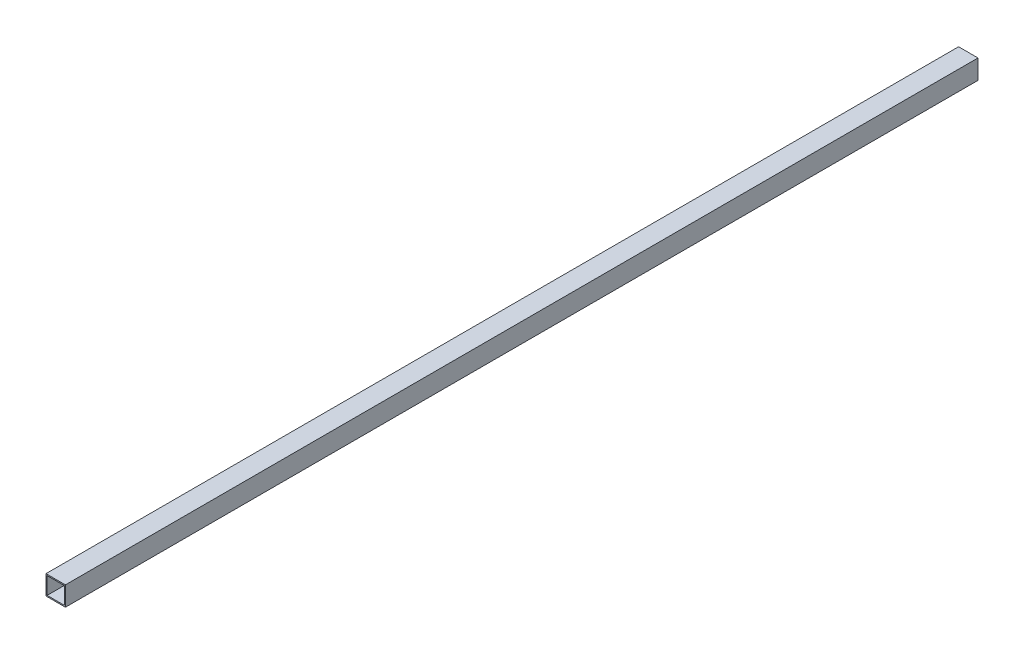
ISO-10303-21;
HEADER;
FILE_DESCRIPTION(('STEP AP214'),'2;1');
FILE_NAME('part.step','',(''),(''),'','','');
FILE_SCHEMA(('AUTOMOTIVE_DESIGN { 1 0 10303 214 1 1 1 1 }'));
ENDSEC;
DATA;
#1=APPLICATION_CONTEXT('core data for automotive mechanical design processes');
#2=APPLICATION_PROTOCOL_DEFINITION('international standard','automotive_design',2000,#1);
#3=PRODUCT_CONTEXT('',#1,'mechanical');
#4=PRODUCT('Part','Part','',(#3));
#5=PRODUCT_RELATED_PRODUCT_CATEGORY('part','',(#4));
#6=PRODUCT_DEFINITION_FORMATION('','',#4);
#7=PRODUCT_DEFINITION_CONTEXT('part definition',#1,'design');
#8=PRODUCT_DEFINITION('design','',#6,#7);
#9=PRODUCT_DEFINITION_SHAPE('','',#8);
#10=(LENGTH_UNIT() NAMED_UNIT(*) SI_UNIT(.MILLI.,.METRE.));
#11=(NAMED_UNIT(*) PLANE_ANGLE_UNIT() SI_UNIT($,.RADIAN.));
#12=(NAMED_UNIT(*) SI_UNIT($,.STERADIAN.) SOLID_ANGLE_UNIT());
#13=UNCERTAINTY_MEASURE_WITH_UNIT(LENGTH_MEASURE(1.E-05),#10,'distance_accuracy_value','');
#14=(GEOMETRIC_REPRESENTATION_CONTEXT(3) GLOBAL_UNCERTAINTY_ASSIGNED_CONTEXT((#13)) GLOBAL_UNIT_ASSIGNED_CONTEXT((#10,
#11,#12)) REPRESENTATION_CONTEXT('',''));
#15=CARTESIAN_POINT('',(0.,0.,0.));
#16=DIRECTION('',(0.,0.,1.));
#17=DIRECTION('',(1.,0.,0.));
#18=AXIS2_PLACEMENT_3D('',#15,#16,#17);
#19=CARTESIAN_POINT('',(0.,0.,1193.8));
#20=DIRECTION('',(0.,0.,1.));
#21=DIRECTION('',(1.,0.,0.));
#22=AXIS2_PLACEMENT_3D('',#19,#20,#21);
#23=PLANE('',#22);
#24=DIRECTION('',(0.,-1.,0.));
#25=VECTOR('',#24,1.);
#26=CARTESIAN_POINT('',(0.,0.,1193.8));
#27=LINE('',#26,#25);
#28=CARTESIAN_POINT('',(0.,25.4,1193.8));
#29=VERTEX_POINT('',#28);
#30=CARTESIAN_POINT('',(0.,0.,1193.8));
#31=VERTEX_POINT('',#30);
#32=EDGE_CURVE('E161',#29,#31,#27,.T.);
#33=ORIENTED_EDGE('',*,*,#32,.T.);
#34=DIRECTION('',(1.,0.,0.));
#35=VECTOR('',#34,1.);
#36=CARTESIAN_POINT('',(0.,0.,1193.8));
#37=LINE('',#36,#35);
#38=CARTESIAN_POINT('',(25.4,0.,1193.8));
#39=VERTEX_POINT('',#38);
#40=EDGE_CURVE('E164',#31,#39,#37,.T.);
#41=ORIENTED_EDGE('',*,*,#40,.T.);
#42=DIRECTION('',(0.,1.,0.));
#43=VECTOR('',#42,1.);
#44=CARTESIAN_POINT('',(25.4,0.,1193.8));
#45=LINE('',#44,#43);
#46=CARTESIAN_POINT('',(25.4,25.4,1193.8));
#47=VERTEX_POINT('',#46);
#48=EDGE_CURVE('E167',#39,#47,#45,.T.);
#49=ORIENTED_EDGE('',*,*,#48,.T.);
#50=DIRECTION('',(-1.,0.,0.));
#51=VECTOR('',#50,1.);
#52=CARTESIAN_POINT('',(0.,25.4,1193.8));
#53=LINE('',#52,#51);
#54=EDGE_CURVE('E169',#47,#29,#53,.T.);
#55=ORIENTED_EDGE('',*,*,#54,.T.);
#56=EDGE_LOOP('',(#33,#41,#49,#55));
#57=FACE_BOUND('',#56,.T.);
#58=DIRECTION('',(1.,0.,0.));
#59=VECTOR('',#58,1.);
#60=CARTESIAN_POINT('',(0.,1.524,1193.8));
#61=LINE('',#60,#59);
#62=CARTESIAN_POINT('',(1.524,1.524,1193.8));
#63=VERTEX_POINT('',#62);
#64=CARTESIAN_POINT('',(23.876,1.524,1193.8));
#65=VERTEX_POINT('',#64);
#66=EDGE_CURVE('E133',#63,#65,#61,.T.);
#67=ORIENTED_EDGE('',*,*,#66,.F.);
#68=DIRECTION('',(0.,-1.,0.));
#69=VECTOR('',#68,1.);
#70=CARTESIAN_POINT('',(1.524,0.,1193.8));
#71=LINE('',#70,#69);
#72=CARTESIAN_POINT('',(1.524,23.876,1193.8));
#73=VERTEX_POINT('',#72);
#74=EDGE_CURVE('E125',#73,#63,#71,.T.);
#75=ORIENTED_EDGE('',*,*,#74,.F.);
#76=DIRECTION('',(-1.,0.,0.));
#77=VECTOR('',#76,1.);
#78=CARTESIAN_POINT('',(0.,23.876,1193.8));
#79=LINE('',#78,#77);
#80=CARTESIAN_POINT('',(23.876,23.876,1193.8));
#81=VERTEX_POINT('',#80);
#82=EDGE_CURVE('E147',#81,#73,#79,.T.);
#83=ORIENTED_EDGE('',*,*,#82,.F.);
#84=DIRECTION('',(0.,1.,0.));
#85=VECTOR('',#84,1.);
#86=CARTESIAN_POINT('',(23.876,0.,1193.8));
#87=LINE('',#86,#85);
#88=EDGE_CURVE('E145',#65,#81,#87,.T.);
#89=ORIENTED_EDGE('',*,*,#88,.F.);
#90=EDGE_LOOP('',(#67,#75,#83,#89));
#91=FACE_BOUND('',#90,.T.);
#92=ADVANCED_FACE('F60',(#57,#91),#23,.T.);
#93=CARTESIAN_POINT('',(0.,0.,0.));
#94=DIRECTION('',(0.,0.,1.));
#95=DIRECTION('',(1.,0.,0.));
#96=AXIS2_PLACEMENT_3D('',#93,#94,#95);
#97=PLANE('',#96);
#98=DIRECTION('',(0.,-1.,0.));
#99=VECTOR('',#98,1.);
#100=CARTESIAN_POINT('',(0.,0.,0.));
#101=LINE('',#100,#99);
#102=CARTESIAN_POINT('',(0.,25.4,0.));
#103=VERTEX_POINT('',#102);
#104=CARTESIAN_POINT('',(0.,0.,0.));
#105=VERTEX_POINT('',#104);
#106=EDGE_CURVE('E141',#103,#105,#101,.T.);
#107=ORIENTED_EDGE('',*,*,#106,.F.);
#108=DIRECTION('',(-1.,0.,0.));
#109=VECTOR('',#108,1.);
#110=CARTESIAN_POINT('',(0.,25.4,0.));
#111=LINE('',#110,#109);
#112=CARTESIAN_POINT('',(25.4,25.4,0.));
#113=VERTEX_POINT('',#112);
#114=EDGE_CURVE('E165',#113,#103,#111,.T.);
#115=ORIENTED_EDGE('',*,*,#114,.F.);
#116=DIRECTION('',(0.,1.,0.));
#117=VECTOR('',#116,1.);
#118=CARTESIAN_POINT('',(25.4,0.,0.));
#119=LINE('',#118,#117);
#120=CARTESIAN_POINT('',(25.4,0.,0.));
#121=VERTEX_POINT('',#120);
#122=EDGE_CURVE('E176',#121,#113,#119,.T.);
#123=ORIENTED_EDGE('',*,*,#122,.F.);
#124=DIRECTION('',(1.,0.,0.));
#125=VECTOR('',#124,1.);
#126=CARTESIAN_POINT('',(0.,0.,0.));
#127=LINE('',#126,#125);
#128=EDGE_CURVE('E174',#105,#121,#127,.T.);
#129=ORIENTED_EDGE('',*,*,#128,.F.);
#130=EDGE_LOOP('',(#107,#115,#123,#129));
#131=FACE_BOUND('',#130,.T.);
#132=DIRECTION('',(0.,-1.,0.));
#133=VECTOR('',#132,1.);
#134=CARTESIAN_POINT('',(1.524,0.,0.));
#135=LINE('',#134,#133);
#136=CARTESIAN_POINT('',(1.524,23.876,0.));
#137=VERTEX_POINT('',#136);
#138=CARTESIAN_POINT('',(1.524,1.524,0.));
#139=VERTEX_POINT('',#138);
#140=EDGE_CURVE('E83',#137,#139,#135,.T.);
#141=ORIENTED_EDGE('',*,*,#140,.T.);
#142=DIRECTION('',(1.,0.,0.));
#143=VECTOR('',#142,1.);
#144=CARTESIAN_POINT('',(0.,1.524,0.));
#145=LINE('',#144,#143);
#146=CARTESIAN_POINT('',(23.876,1.524,0.));
#147=VERTEX_POINT('',#146);
#148=EDGE_CURVE('E140',#139,#147,#145,.T.);
#149=ORIENTED_EDGE('',*,*,#148,.T.);
#150=DIRECTION('',(0.,1.,0.));
#151=VECTOR('',#150,1.);
#152=CARTESIAN_POINT('',(23.876,0.,0.));
#153=LINE('',#152,#151);
#154=CARTESIAN_POINT('',(23.876,23.876,0.));
#155=VERTEX_POINT('',#154);
#156=EDGE_CURVE('E153',#147,#155,#153,.T.);
#157=ORIENTED_EDGE('',*,*,#156,.T.);
#158=DIRECTION('',(-1.,0.,0.));
#159=VECTOR('',#158,1.);
#160=CARTESIAN_POINT('',(0.,23.876,0.));
#161=LINE('',#160,#159);
#162=EDGE_CURVE('E134',#155,#137,#161,.T.);
#163=ORIENTED_EDGE('',*,*,#162,.T.);
#164=EDGE_LOOP('',(#141,#149,#157,#163));
#165=FACE_BOUND('',#164,.T.);
#166=ADVANCED_FACE('F194',(#131,#165),#97,.F.);
#167=CARTESIAN_POINT('',(0.,0.,1193.8));
#168=DIRECTION('',(1.,0.,0.));
#169=DIRECTION('',(0.,0.,-1.));
#170=AXIS2_PLACEMENT_3D('',#167,#168,#169);
#171=PLANE('',#170);
#172=ORIENTED_EDGE('',*,*,#106,.T.);
#173=DIRECTION('',(0.,0.,-1.));
#174=VECTOR('',#173,1.);
#175=CARTESIAN_POINT('',(0.,0.,1193.8));
#176=LINE('',#175,#174);
#177=EDGE_CURVE('E12',#31,#105,#176,.T.);
#178=ORIENTED_EDGE('',*,*,#177,.F.);
#179=ORIENTED_EDGE('',*,*,#32,.F.);
#180=DIRECTION('',(0.,0.,-1.));
#181=VECTOR('',#180,1.);
#182=CARTESIAN_POINT('',(0.,25.4,1193.8));
#183=LINE('',#182,#181);
#184=EDGE_CURVE('E171',#29,#103,#183,.T.);
#185=ORIENTED_EDGE('',*,*,#184,.T.);
#186=EDGE_LOOP('',(#172,#178,#179,#185));
#187=FACE_BOUND('',#186,.T.);
#188=ADVANCED_FACE('F62',(#187),#171,.F.);
#189=CARTESIAN_POINT('',(0.,0.,1193.8));
#190=DIRECTION('',(0.,1.,0.));
#191=DIRECTION('',(0.,0.,1.));
#192=AXIS2_PLACEMENT_3D('',#189,#190,#191);
#193=PLANE('',#192);
#194=ORIENTED_EDGE('',*,*,#128,.T.);
#195=DIRECTION('',(0.,0.,-1.));
#196=VECTOR('',#195,1.);
#197=CARTESIAN_POINT('',(25.4,0.,1193.8));
#198=LINE('',#197,#196);
#199=EDGE_CURVE('E68',#39,#121,#198,.T.);
#200=ORIENTED_EDGE('',*,*,#199,.F.);
#201=ORIENTED_EDGE('',*,*,#40,.F.);
#202=ORIENTED_EDGE('',*,*,#177,.T.);
#203=EDGE_LOOP('',(#194,#200,#201,#202));
#204=FACE_BOUND('',#203,.T.);
#205=ADVANCED_FACE('F204',(#204),#193,.F.);
#206=CARTESIAN_POINT('',(25.4,0.,1193.8));
#207=DIRECTION('',(-1.,0.,0.));
#208=DIRECTION('',(0.,0.,1.));
#209=AXIS2_PLACEMENT_3D('',#206,#207,#208);
#210=PLANE('',#209);
#211=ORIENTED_EDGE('',*,*,#122,.T.);
#212=DIRECTION('',(0.,0.,-1.));
#213=VECTOR('',#212,1.);
#214=CARTESIAN_POINT('',(25.4,25.4,1193.8));
#215=LINE('',#214,#213);
#216=EDGE_CURVE('E181',#47,#113,#215,.T.);
#217=ORIENTED_EDGE('',*,*,#216,.F.);
#218=ORIENTED_EDGE('',*,*,#48,.F.);
#219=ORIENTED_EDGE('',*,*,#199,.T.);
#220=EDGE_LOOP('',(#211,#217,#218,#219));
#221=FACE_BOUND('',#220,.T.);
#222=ADVANCED_FACE('F188',(#221),#210,.F.);
#223=CARTESIAN_POINT('',(0.,25.4,1193.8));
#224=DIRECTION('',(0.,-1.,0.));
#225=DIRECTION('',(0.,0.,-1.));
#226=AXIS2_PLACEMENT_3D('',#223,#224,#225);
#227=PLANE('',#226);
#228=ORIENTED_EDGE('',*,*,#114,.T.);
#229=ORIENTED_EDGE('',*,*,#184,.F.);
#230=ORIENTED_EDGE('',*,*,#54,.F.);
#231=ORIENTED_EDGE('',*,*,#216,.T.);
#232=EDGE_LOOP('',(#228,#229,#230,#231));
#233=FACE_BOUND('',#232,.T.);
#234=ADVANCED_FACE('F198',(#233),#227,.F.);
#235=CARTESIAN_POINT('',(1.524,0.,1193.8));
#236=DIRECTION('',(1.,0.,0.));
#237=DIRECTION('',(0.,0.,-1.));
#238=AXIS2_PLACEMENT_3D('',#235,#236,#237);
#239=PLANE('',#238);
#240=ORIENTED_EDGE('',*,*,#140,.F.);
#241=DIRECTION('',(0.,0.,-1.));
#242=VECTOR('',#241,1.);
#243=CARTESIAN_POINT('',(1.524,23.876,1193.8));
#244=LINE('',#243,#242);
#245=EDGE_CURVE('E129',#73,#137,#244,.T.);
#246=ORIENTED_EDGE('',*,*,#245,.F.);
#247=ORIENTED_EDGE('',*,*,#74,.T.);
#248=DIRECTION('',(0.,0.,-1.));
#249=VECTOR('',#248,1.);
#250=CARTESIAN_POINT('',(1.524,1.524,1193.8));
#251=LINE('',#250,#249);
#252=EDGE_CURVE('E128',#63,#139,#251,.T.);
#253=ORIENTED_EDGE('',*,*,#252,.T.);
#254=EDGE_LOOP('',(#240,#246,#247,#253));
#255=FACE_BOUND('',#254,.T.);
#256=ADVANCED_FACE('F127',(#255),#239,.T.);
#257=CARTESIAN_POINT('',(0.,1.524,1193.8));
#258=DIRECTION('',(0.,1.,0.));
#259=DIRECTION('',(0.,0.,1.));
#260=AXIS2_PLACEMENT_3D('',#257,#258,#259);
#261=PLANE('',#260);
#262=ORIENTED_EDGE('',*,*,#148,.F.);
#263=ORIENTED_EDGE('',*,*,#252,.F.);
#264=ORIENTED_EDGE('',*,*,#66,.T.);
#265=DIRECTION('',(0.,0.,-1.));
#266=VECTOR('',#265,1.);
#267=CARTESIAN_POINT('',(23.876,1.524,1193.8));
#268=LINE('',#267,#266);
#269=EDGE_CURVE('E142',#65,#147,#268,.T.);
#270=ORIENTED_EDGE('',*,*,#269,.T.);
#271=EDGE_LOOP('',(#262,#263,#264,#270));
#272=FACE_BOUND('',#271,.T.);
#273=ADVANCED_FACE('F137',(#272),#261,.T.);
#274=CARTESIAN_POINT('',(23.876,0.,1193.8));
#275=DIRECTION('',(-1.,0.,0.));
#276=DIRECTION('',(0.,0.,1.));
#277=AXIS2_PLACEMENT_3D('',#274,#275,#276);
#278=PLANE('',#277);
#279=ORIENTED_EDGE('',*,*,#156,.F.);
#280=ORIENTED_EDGE('',*,*,#269,.F.);
#281=ORIENTED_EDGE('',*,*,#88,.T.);
#282=DIRECTION('',(0.,0.,-1.));
#283=VECTOR('',#282,1.);
#284=CARTESIAN_POINT('',(23.876,23.876,1193.8));
#285=LINE('',#284,#283);
#286=EDGE_CURVE('E75',#81,#155,#285,.T.);
#287=ORIENTED_EDGE('',*,*,#286,.T.);
#288=EDGE_LOOP('',(#279,#280,#281,#287));
#289=FACE_BOUND('',#288,.T.);
#290=ADVANCED_FACE('F227',(#289),#278,.T.);
#291=CARTESIAN_POINT('',(0.,23.876,1193.8));
#292=DIRECTION('',(0.,-1.,0.));
#293=DIRECTION('',(0.,0.,-1.));
#294=AXIS2_PLACEMENT_3D('',#291,#292,#293);
#295=PLANE('',#294);
#296=ORIENTED_EDGE('',*,*,#162,.F.);
#297=ORIENTED_EDGE('',*,*,#286,.F.);
#298=ORIENTED_EDGE('',*,*,#82,.T.);
#299=ORIENTED_EDGE('',*,*,#245,.T.);
#300=EDGE_LOOP('',(#296,#297,#298,#299));
#301=FACE_BOUND('',#300,.T.);
#302=ADVANCED_FACE('F231',(#301),#295,.T.);
#303=CLOSED_SHELL('',(#92,#166,#188,#205,#222,#234,#256,#273,#290,#302));
#304=MANIFOLD_SOLID_BREP('B2',#303);
#305=ADVANCED_BREP_SHAPE_REPRESENTATION('',(#18,#304),#14);
#306=SHAPE_DEFINITION_REPRESENTATION(#9,#305);
ENDSEC;
END-ISO-10303-21;
